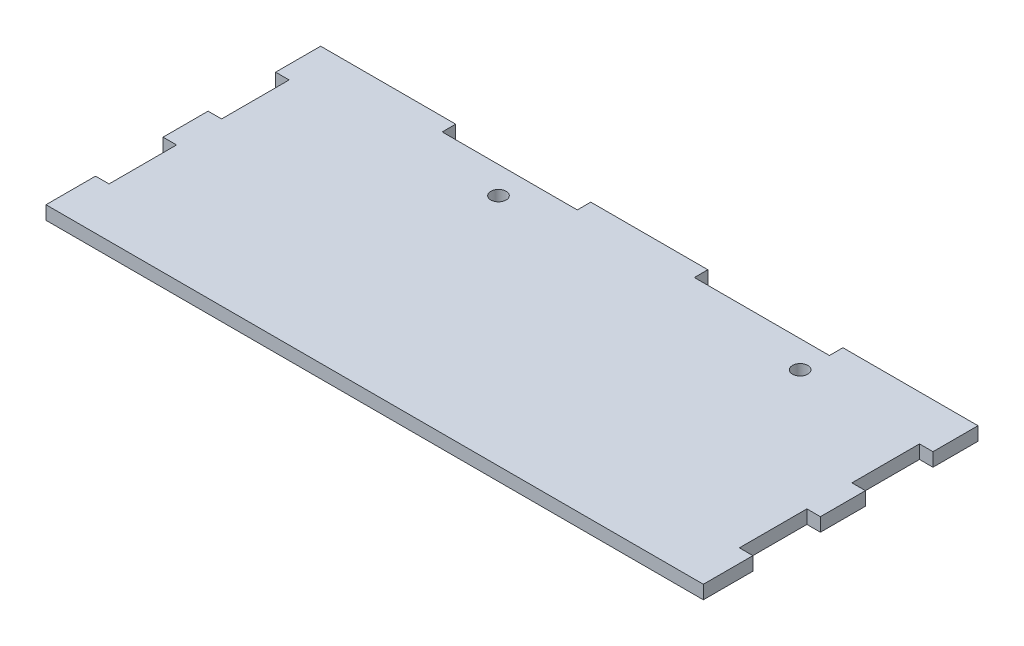
ISO-10303-21;
HEADER;
FILE_DESCRIPTION(('STEP AP214'),'2;1');
FILE_NAME('part.step','',(''),(''),'','','');
FILE_SCHEMA(('AUTOMOTIVE_DESIGN { 1 0 10303 214 1 1 1 1 }'));
ENDSEC;
DATA;
#1=APPLICATION_CONTEXT('core data for automotive mechanical design processes');
#2=APPLICATION_PROTOCOL_DEFINITION('international standard','automotive_design',2000,#1);
#3=PRODUCT_CONTEXT('',#1,'mechanical');
#4=PRODUCT('Part','Part','',(#3));
#5=PRODUCT_RELATED_PRODUCT_CATEGORY('part','',(#4));
#6=PRODUCT_DEFINITION_FORMATION('','',#4);
#7=PRODUCT_DEFINITION_CONTEXT('part definition',#1,'design');
#8=PRODUCT_DEFINITION('design','',#6,#7);
#9=PRODUCT_DEFINITION_SHAPE('','',#8);
#10=(LENGTH_UNIT() NAMED_UNIT(*) SI_UNIT(.MILLI.,.METRE.));
#11=(NAMED_UNIT(*) PLANE_ANGLE_UNIT() SI_UNIT($,.RADIAN.));
#12=(NAMED_UNIT(*) SI_UNIT($,.STERADIAN.) SOLID_ANGLE_UNIT());
#13=UNCERTAINTY_MEASURE_WITH_UNIT(LENGTH_MEASURE(1.E-05),#10,'distance_accuracy_value','');
#14=(GEOMETRIC_REPRESENTATION_CONTEXT(3) GLOBAL_UNCERTAINTY_ASSIGNED_CONTEXT((#13)) GLOBAL_UNIT_ASSIGNED_CONTEXT((#10,
#11,#12)) REPRESENTATION_CONTEXT('',''));
#15=CARTESIAN_POINT('',(0.,0.,0.));
#16=DIRECTION('',(0.,0.,1.));
#17=DIRECTION('',(1.,0.,0.));
#18=AXIS2_PLACEMENT_3D('',#15,#16,#17);
#19=CARTESIAN_POINT('',(-73.,3.,30.5));
#20=DIRECTION('',(1.,0.,0.));
#21=DIRECTION('',(0.,0.,-1.));
#22=AXIS2_PLACEMENT_3D('',#19,#20,#21);
#23=PLANE('',#22);
#24=DIRECTION('',(0.,0.,1.));
#25=VECTOR('',#24,1.);
#26=CARTESIAN_POINT('',(-73.,0.,30.5));
#27=LINE('',#26,#25);
#28=CARTESIAN_POINT('',(-73.,0.,-5.49999999999998));
#29=VERTEX_POINT('',#28);
#30=CARTESIAN_POINT('',(-73.,0.,4.50000000000002));
#31=VERTEX_POINT('',#30);
#32=EDGE_CURVE('E284',#29,#31,#27,.T.);
#33=ORIENTED_EDGE('',*,*,#32,.T.);
#34=DIRECTION('',(0.,1.,0.));
#35=VECTOR('',#34,1.);
#36=CARTESIAN_POINT('',(-73.,-7.,4.50000000000002));
#37=LINE('',#36,#35);
#38=CARTESIAN_POINT('',(-73.,3.,4.50000000000002));
#39=VERTEX_POINT('',#38);
#40=EDGE_CURVE('E526',#31,#39,#37,.T.);
#41=ORIENTED_EDGE('',*,*,#40,.T.);
#42=DIRECTION('',(0.,0.,1.));
#43=VECTOR('',#42,1.);
#44=CARTESIAN_POINT('',(-73.,3.,30.5));
#45=LINE('',#44,#43);
#46=CARTESIAN_POINT('',(-73.,3.,-5.49999999999998));
#47=VERTEX_POINT('',#46);
#48=EDGE_CURVE('E459',#47,#39,#45,.T.);
#49=ORIENTED_EDGE('',*,*,#48,.F.);
#50=DIRECTION('',(0.,1.,0.));
#51=VECTOR('',#50,1.);
#52=CARTESIAN_POINT('',(-73.,-7.,-5.49999999999998));
#53=LINE('',#52,#51);
#54=EDGE_CURVE('E428',#29,#47,#53,.T.);
#55=ORIENTED_EDGE('',*,*,#54,.F.);
#56=EDGE_LOOP('',(#33,#41,#49,#55));
#57=FACE_BOUND('',#56,.T.);
#58=ADVANCED_FACE('F51',(#57),#23,.F.);
#59=CARTESIAN_POINT('',(-73.,0.,-30.5));
#60=VERTEX_POINT('',#59);
#61=CARTESIAN_POINT('',(-73.,0.,-20.5));
#62=VERTEX_POINT('',#61);
#63=EDGE_CURVE('E279',#60,#62,#27,.T.);
#64=ORIENTED_EDGE('',*,*,#63,.T.);
#65=DIRECTION('',(0.,1.,0.));
#66=VECTOR('',#65,1.);
#67=CARTESIAN_POINT('',(-73.,-7.,-20.5));
#68=LINE('',#67,#66);
#69=CARTESIAN_POINT('',(-73.,3.,-20.5));
#70=VERTEX_POINT('',#69);
#71=EDGE_CURVE('E438',#62,#70,#68,.T.);
#72=ORIENTED_EDGE('',*,*,#71,.T.);
#73=CARTESIAN_POINT('',(-73.,3.,-30.5));
#74=VERTEX_POINT('',#73);
#75=EDGE_CURVE('E455',#74,#70,#45,.T.);
#76=ORIENTED_EDGE('',*,*,#75,.F.);
#77=DIRECTION('',(0.,-1.,0.));
#78=VECTOR('',#77,1.);
#79=CARTESIAN_POINT('',(-73.,3.,-30.5));
#80=LINE('',#79,#78);
#81=EDGE_CURVE('E274',#74,#60,#80,.T.);
#82=ORIENTED_EDGE('',*,*,#81,.T.);
#83=EDGE_LOOP('',(#64,#72,#76,#82));
#84=FACE_BOUND('',#83,.T.);
#85=ADVANCED_FACE('F590',(#84),#23,.F.);
#86=CARTESIAN_POINT('',(73.,3.,30.5));
#87=DIRECTION('',(-1.,0.,0.));
#88=DIRECTION('',(0.,0.,1.));
#89=AXIS2_PLACEMENT_3D('',#86,#87,#88);
#90=PLANE('',#89);
#91=DIRECTION('',(0.,0.,-1.));
#92=VECTOR('',#91,1.);
#93=CARTESIAN_POINT('',(73.,0.,30.5));
#94=LINE('',#93,#92);
#95=CARTESIAN_POINT('',(73.,0.,4.50000000000002));
#96=VERTEX_POINT('',#95);
#97=CARTESIAN_POINT('',(73.,0.,-5.49999999999998));
#98=VERTEX_POINT('',#97);
#99=EDGE_CURVE('E294',#96,#98,#94,.T.);
#100=ORIENTED_EDGE('',*,*,#99,.T.);
#101=DIRECTION('',(0.,1.,0.));
#102=VECTOR('',#101,1.);
#103=CARTESIAN_POINT('',(73.,-7.,-5.49999999999998));
#104=LINE('',#103,#102);
#105=CARTESIAN_POINT('',(73.,3.,-5.49999999999998));
#106=VERTEX_POINT('',#105);
#107=EDGE_CURVE('E403',#98,#106,#104,.T.);
#108=ORIENTED_EDGE('',*,*,#107,.T.);
#109=DIRECTION('',(0.,0.,-1.));
#110=VECTOR('',#109,1.);
#111=CARTESIAN_POINT('',(73.,3.,30.5));
#112=LINE('',#111,#110);
#113=CARTESIAN_POINT('',(73.,3.,4.50000000000002));
#114=VERTEX_POINT('',#113);
#115=EDGE_CURVE('E466',#114,#106,#112,.T.);
#116=ORIENTED_EDGE('',*,*,#115,.F.);
#117=DIRECTION('',(0.,1.,0.));
#118=VECTOR('',#117,1.);
#119=CARTESIAN_POINT('',(73.,-7.,4.50000000000002));
#120=LINE('',#119,#118);
#121=EDGE_CURVE('E486',#96,#114,#120,.T.);
#122=ORIENTED_EDGE('',*,*,#121,.F.);
#123=EDGE_LOOP('',(#100,#108,#116,#122));
#124=FACE_BOUND('',#123,.T.);
#125=ADVANCED_FACE('F576',(#124),#90,.F.);
#126=CARTESIAN_POINT('',(73.,3.,-20.5));
#127=VERTEX_POINT('',#126);
#128=CARTESIAN_POINT('',(73.,3.,-30.5));
#129=VERTEX_POINT('',#128);
#130=EDGE_CURVE('E461',#127,#129,#112,.T.);
#131=ORIENTED_EDGE('',*,*,#130,.F.);
#132=DIRECTION('',(0.,1.,0.));
#133=VECTOR('',#132,1.);
#134=CARTESIAN_POINT('',(73.,-7.,-20.5));
#135=LINE('',#134,#133);
#136=CARTESIAN_POINT('',(73.,0.,-20.5));
#137=VERTEX_POINT('',#136);
#138=EDGE_CURVE('E407',#137,#127,#135,.T.);
#139=ORIENTED_EDGE('',*,*,#138,.F.);
#140=CARTESIAN_POINT('',(73.,0.,-30.5));
#141=VERTEX_POINT('',#140);
#142=EDGE_CURVE('E288',#137,#141,#94,.T.);
#143=ORIENTED_EDGE('',*,*,#142,.T.);
#144=DIRECTION('',(0.,-1.,0.));
#145=VECTOR('',#144,1.);
#146=CARTESIAN_POINT('',(73.,3.,-30.5));
#147=LINE('',#146,#145);
#148=EDGE_CURVE('E304',#129,#141,#147,.T.);
#149=ORIENTED_EDGE('',*,*,#148,.F.);
#150=EDGE_LOOP('',(#131,#139,#143,#149));
#151=FACE_BOUND('',#150,.T.);
#152=ADVANCED_FACE('F549',(#151),#90,.F.);
#153=CARTESIAN_POINT('',(73.,3.,-30.5));
#154=DIRECTION('',(0.,0.,1.));
#155=DIRECTION('',(1.,0.,0.));
#156=AXIS2_PLACEMENT_3D('',#153,#154,#155);
#157=PLANE('',#156);
#158=DIRECTION('',(-1.,0.,0.));
#159=VECTOR('',#158,1.);
#160=CARTESIAN_POINT('',(73.,3.,-30.5));
#161=LINE('',#160,#159);
#162=CARTESIAN_POINT('',(13.,3.,-30.5));
#163=VERTEX_POINT('',#162);
#164=CARTESIAN_POINT('',(-13.,3.,-30.5));
#165=VERTEX_POINT('',#164);
#166=EDGE_CURVE('E258',#163,#165,#161,.T.);
#167=ORIENTED_EDGE('',*,*,#166,.F.);
#168=DIRECTION('',(0.,1.,0.));
#169=VECTOR('',#168,1.);
#170=CARTESIAN_POINT('',(13.,-7.,-30.5));
#171=LINE('',#170,#169);
#172=CARTESIAN_POINT('',(13.,0.,-30.5));
#173=VERTEX_POINT('',#172);
#174=EDGE_CURVE('E237',#173,#163,#171,.T.);
#175=ORIENTED_EDGE('',*,*,#174,.F.);
#176=DIRECTION('',(-1.,0.,0.));
#177=VECTOR('',#176,1.);
#178=CARTESIAN_POINT('',(73.,0.,-30.5));
#179=LINE('',#178,#177);
#180=CARTESIAN_POINT('',(-13.,0.,-30.5));
#181=VERTEX_POINT('',#180);
#182=EDGE_CURVE('E300',#173,#181,#179,.T.);
#183=ORIENTED_EDGE('',*,*,#182,.T.);
#184=DIRECTION('',(0.,1.,0.));
#185=VECTOR('',#184,1.);
#186=CARTESIAN_POINT('',(-13.,-7.,-30.5));
#187=LINE('',#186,#185);
#188=EDGE_CURVE('E263',#181,#165,#187,.T.);
#189=ORIENTED_EDGE('',*,*,#188,.T.);
#190=EDGE_LOOP('',(#167,#175,#183,#189));
#191=FACE_BOUND('',#190,.T.);
#192=ADVANCED_FACE('F266',(#191),#157,.F.);
#193=CARTESIAN_POINT('',(43.,0.,-30.5));
#194=VERTEX_POINT('',#193);
#195=EDGE_CURVE('E295',#141,#194,#179,.T.);
#196=ORIENTED_EDGE('',*,*,#195,.T.);
#197=DIRECTION('',(0.,1.,0.));
#198=VECTOR('',#197,1.);
#199=CARTESIAN_POINT('',(43.,-7.,-30.5));
#200=LINE('',#199,#198);
#201=CARTESIAN_POINT('',(43.,3.,-30.5));
#202=VERTEX_POINT('',#201);
#203=EDGE_CURVE('E250',#194,#202,#200,.T.);
#204=ORIENTED_EDGE('',*,*,#203,.T.);
#205=EDGE_CURVE('E268',#129,#202,#161,.T.);
#206=ORIENTED_EDGE('',*,*,#205,.F.);
#207=ORIENTED_EDGE('',*,*,#148,.T.);
#208=EDGE_LOOP('',(#196,#204,#206,#207));
#209=FACE_BOUND('',#208,.T.);
#210=ADVANCED_FACE('F554',(#209),#157,.F.);
#211=CARTESIAN_POINT('',(-73.,3.,19.5));
#212=VERTEX_POINT('',#211);
#213=CARTESIAN_POINT('',(-73.,3.,30.5));
#214=VERTEX_POINT('',#213);
#215=EDGE_CURVE('E299',#212,#214,#45,.T.);
#216=ORIENTED_EDGE('',*,*,#215,.F.);
#217=DIRECTION('',(0.,1.,0.));
#218=VECTOR('',#217,1.);
#219=CARTESIAN_POINT('',(-73.,-7.,19.5));
#220=LINE('',#219,#218);
#221=CARTESIAN_POINT('',(-73.,0.,19.5));
#222=VERTEX_POINT('',#221);
#223=EDGE_CURVE('E531',#222,#212,#220,.T.);
#224=ORIENTED_EDGE('',*,*,#223,.F.);
#225=CARTESIAN_POINT('',(-73.,0.,30.5));
#226=VERTEX_POINT('',#225);
#227=EDGE_CURVE('E285',#222,#226,#27,.T.);
#228=ORIENTED_EDGE('',*,*,#227,.T.);
#229=DIRECTION('',(0.,-1.,0.));
#230=VECTOR('',#229,1.);
#231=CARTESIAN_POINT('',(-73.,3.,30.5));
#232=LINE('',#231,#230);
#233=EDGE_CURVE('E312',#214,#226,#232,.T.);
#234=ORIENTED_EDGE('',*,*,#233,.F.);
#235=EDGE_LOOP('',(#216,#224,#228,#234));
#236=FACE_BOUND('',#235,.T.);
#237=ADVANCED_FACE('F53',(#236),#23,.F.);
#238=CARTESIAN_POINT('',(73.,3.,30.5));
#239=DIRECTION('',(0.,0.,-1.));
#240=DIRECTION('',(-1.,0.,0.));
#241=AXIS2_PLACEMENT_3D('',#238,#239,#240);
#242=PLANE('',#241);
#243=DIRECTION('',(1.,0.,0.));
#244=VECTOR('',#243,1.);
#245=CARTESIAN_POINT('',(73.,0.,30.5));
#246=LINE('',#245,#244);
#247=CARTESIAN_POINT('',(73.,0.,30.5));
#248=VERTEX_POINT('',#247);
#249=EDGE_CURVE('E283',#226,#248,#246,.T.);
#250=ORIENTED_EDGE('',*,*,#249,.T.);
#251=DIRECTION('',(0.,-1.,0.));
#252=VECTOR('',#251,1.);
#253=CARTESIAN_POINT('',(73.,3.,30.5));
#254=LINE('',#253,#252);
#255=CARTESIAN_POINT('',(73.,3.,30.5));
#256=VERTEX_POINT('',#255);
#257=EDGE_CURVE('E308',#256,#248,#254,.T.);
#258=ORIENTED_EDGE('',*,*,#257,.F.);
#259=DIRECTION('',(1.,0.,0.));
#260=VECTOR('',#259,1.);
#261=CARTESIAN_POINT('',(73.,3.,30.5));
#262=LINE('',#261,#260);
#263=EDGE_CURVE('E458',#214,#256,#262,.T.);
#264=ORIENTED_EDGE('',*,*,#263,.F.);
#265=ORIENTED_EDGE('',*,*,#233,.T.);
#266=EDGE_LOOP('',(#250,#258,#264,#265));
#267=FACE_BOUND('',#266,.T.);
#268=ADVANCED_FACE('F599',(#267),#242,.F.);
#269=CARTESIAN_POINT('',(73.,0.,19.5));
#270=VERTEX_POINT('',#269);
#271=EDGE_CURVE('E289',#248,#270,#94,.T.);
#272=ORIENTED_EDGE('',*,*,#271,.T.);
#273=DIRECTION('',(0.,1.,0.));
#274=VECTOR('',#273,1.);
#275=CARTESIAN_POINT('',(73.,-7.,19.5));
#276=LINE('',#275,#274);
#277=CARTESIAN_POINT('',(73.,3.,19.5));
#278=VERTEX_POINT('',#277);
#279=EDGE_CURVE('E481',#270,#278,#276,.T.);
#280=ORIENTED_EDGE('',*,*,#279,.T.);
#281=EDGE_CURVE('E275',#256,#278,#112,.T.);
#282=ORIENTED_EDGE('',*,*,#281,.F.);
#283=ORIENTED_EDGE('',*,*,#257,.T.);
#284=EDGE_LOOP('',(#272,#280,#282,#283));
#285=FACE_BOUND('',#284,.T.);
#286=ADVANCED_FACE('F479',(#285),#90,.F.);
#287=CARTESIAN_POINT('',(-43.,3.,-30.5));
#288=VERTEX_POINT('',#287);
#289=EDGE_CURVE('E269',#288,#74,#161,.T.);
#290=ORIENTED_EDGE('',*,*,#289,.F.);
#291=DIRECTION('',(0.,1.,0.));
#292=VECTOR('',#291,1.);
#293=CARTESIAN_POINT('',(-43.,-7.,-30.5));
#294=LINE('',#293,#292);
#295=CARTESIAN_POINT('',(-43.,0.,-30.5));
#296=VERTEX_POINT('',#295);
#297=EDGE_CURVE('E505',#296,#288,#294,.T.);
#298=ORIENTED_EDGE('',*,*,#297,.F.);
#299=EDGE_CURVE('E293',#296,#60,#179,.T.);
#300=ORIENTED_EDGE('',*,*,#299,.T.);
#301=ORIENTED_EDGE('',*,*,#81,.F.);
#302=EDGE_LOOP('',(#290,#298,#300,#301));
#303=FACE_BOUND('',#302,.T.);
#304=ADVANCED_FACE('F607',(#303),#157,.F.);
#305=CARTESIAN_POINT('',(0.,3.,0.));
#306=DIRECTION('',(0.,1.,0.));
#307=DIRECTION('',(0.,0.,1.));
#308=AXIS2_PLACEMENT_3D('',#305,#306,#307);
#309=PLANE('',#308);
#310=DIRECTION('',(1.,0.,0.));
#311=VECTOR('',#310,1.);
#312=CARTESIAN_POINT('',(70.,3.,-5.49999999999998));
#313=LINE('',#312,#311);
#314=CARTESIAN_POINT('',(70.,3.,-5.49999999999998));
#315=VERTEX_POINT('',#314);
#316=EDGE_CURVE('E414',#315,#106,#313,.T.);
#317=ORIENTED_EDGE('',*,*,#316,.F.);
#318=DIRECTION('',(0.,0.,1.));
#319=VECTOR('',#318,1.);
#320=CARTESIAN_POINT('',(70.,3.,-20.5));
#321=LINE('',#320,#319);
#322=CARTESIAN_POINT('',(70.,3.,-20.5));
#323=VERTEX_POINT('',#322);
#324=EDGE_CURVE('E400',#323,#315,#321,.T.);
#325=ORIENTED_EDGE('',*,*,#324,.F.);
#326=DIRECTION('',(-1.,0.,0.));
#327=VECTOR('',#326,1.);
#328=CARTESIAN_POINT('',(73.,3.,-20.5));
#329=LINE('',#328,#327);
#330=EDGE_CURVE('E419',#127,#323,#329,.T.);
#331=ORIENTED_EDGE('',*,*,#330,.F.);
#332=ORIENTED_EDGE('',*,*,#130,.T.);
#333=ORIENTED_EDGE('',*,*,#205,.T.);
#334=DIRECTION('',(0.,0.,-1.));
#335=VECTOR('',#334,1.);
#336=CARTESIAN_POINT('',(43.,3.,-27.5));
#337=LINE('',#336,#335);
#338=CARTESIAN_POINT('',(43.,3.,-27.5));
#339=VERTEX_POINT('',#338);
#340=EDGE_CURVE('E555',#339,#202,#337,.T.);
#341=ORIENTED_EDGE('',*,*,#340,.F.);
#342=DIRECTION('',(1.,0.,0.));
#343=VECTOR('',#342,1.);
#344=CARTESIAN_POINT('',(13.,3.,-27.5));
#345=LINE('',#344,#343);
#346=CARTESIAN_POINT('',(13.,3.,-27.5));
#347=VERTEX_POINT('',#346);
#348=EDGE_CURVE('E261',#347,#339,#345,.T.);
#349=ORIENTED_EDGE('',*,*,#348,.F.);
#350=DIRECTION('',(0.,0.,1.));
#351=VECTOR('',#350,1.);
#352=CARTESIAN_POINT('',(13.,3.,-30.5));
#353=LINE('',#352,#351);
#354=EDGE_CURVE('E241',#163,#347,#353,.T.);
#355=ORIENTED_EDGE('',*,*,#354,.F.);
#356=ORIENTED_EDGE('',*,*,#166,.T.);
#357=DIRECTION('',(0.,0.,-1.));
#358=VECTOR('',#357,1.);
#359=CARTESIAN_POINT('',(-13.,3.,-27.5));
#360=LINE('',#359,#358);
#361=CARTESIAN_POINT('',(-13.,3.,-27.5));
#362=VERTEX_POINT('',#361);
#363=EDGE_CURVE('E508',#362,#165,#360,.T.);
#364=ORIENTED_EDGE('',*,*,#363,.F.);
#365=DIRECTION('',(1.,0.,0.));
#366=VECTOR('',#365,1.);
#367=CARTESIAN_POINT('',(-43.,3.,-27.5));
#368=LINE('',#367,#366);
#369=CARTESIAN_POINT('',(-43.,3.,-27.5));
#370=VERTEX_POINT('',#369);
#371=EDGE_CURVE('E519',#370,#362,#368,.T.);
#372=ORIENTED_EDGE('',*,*,#371,.F.);
#373=DIRECTION('',(0.,0.,1.));
#374=VECTOR('',#373,1.);
#375=CARTESIAN_POINT('',(-43.,3.,-30.5));
#376=LINE('',#375,#374);
#377=EDGE_CURVE('E492',#288,#370,#376,.T.);
#378=ORIENTED_EDGE('',*,*,#377,.F.);
#379=ORIENTED_EDGE('',*,*,#289,.T.);
#380=ORIENTED_EDGE('',*,*,#75,.T.);
#381=DIRECTION('',(-1.,0.,0.));
#382=VECTOR('',#381,1.);
#383=CARTESIAN_POINT('',(-73.,3.,-20.5));
#384=LINE('',#383,#382);
#385=CARTESIAN_POINT('',(-70.,3.,-20.5));
#386=VERTEX_POINT('',#385);
#387=EDGE_CURVE('E431',#386,#70,#384,.T.);
#388=ORIENTED_EDGE('',*,*,#387,.F.);
#389=DIRECTION('',(0.,0.,-1.));
#390=VECTOR('',#389,1.);
#391=CARTESIAN_POINT('',(-70.,3.,-20.5));
#392=LINE('',#391,#390);
#393=CARTESIAN_POINT('',(-70.,3.,-5.49999999999998));
#394=VERTEX_POINT('',#393);
#395=EDGE_CURVE('E445',#394,#386,#392,.T.);
#396=ORIENTED_EDGE('',*,*,#395,.F.);
#397=DIRECTION('',(1.,0.,0.));
#398=VECTOR('',#397,1.);
#399=CARTESIAN_POINT('',(-70.,3.,-5.49999999999998));
#400=LINE('',#399,#398);
#401=EDGE_CURVE('E427',#47,#394,#400,.T.);
#402=ORIENTED_EDGE('',*,*,#401,.F.);
#403=ORIENTED_EDGE('',*,*,#48,.T.);
#404=DIRECTION('',(-1.,0.,0.));
#405=VECTOR('',#404,1.);
#406=CARTESIAN_POINT('',(-73.,3.,4.50000000000002));
#407=LINE('',#406,#405);
#408=CARTESIAN_POINT('',(-70.,3.,4.50000000000002));
#409=VERTEX_POINT('',#408);
#410=EDGE_CURVE('E442',#409,#39,#407,.T.);
#411=ORIENTED_EDGE('',*,*,#410,.F.);
#412=DIRECTION('',(0.,0.,-1.));
#413=VECTOR('',#412,1.);
#414=CARTESIAN_POINT('',(-70.,3.,4.50000000000002));
#415=LINE('',#414,#413);
#416=CARTESIAN_POINT('',(-70.,3.,19.5));
#417=VERTEX_POINT('',#416);
#418=EDGE_CURVE('E530',#417,#409,#415,.T.);
#419=ORIENTED_EDGE('',*,*,#418,.F.);
#420=DIRECTION('',(1.,0.,0.));
#421=VECTOR('',#420,1.);
#422=CARTESIAN_POINT('',(-70.,3.,19.5));
#423=LINE('',#422,#421);
#424=EDGE_CURVE('E541',#212,#417,#423,.T.);
#425=ORIENTED_EDGE('',*,*,#424,.F.);
#426=ORIENTED_EDGE('',*,*,#215,.T.);
#427=ORIENTED_EDGE('',*,*,#263,.T.);
#428=ORIENTED_EDGE('',*,*,#281,.T.);
#429=DIRECTION('',(1.,0.,0.));
#430=VECTOR('',#429,1.);
#431=CARTESIAN_POINT('',(70.,3.,19.5));
#432=LINE('',#431,#430);
#433=CARTESIAN_POINT('',(70.,3.,19.5));
#434=VERTEX_POINT('',#433);
#435=EDGE_CURVE('E476',#434,#278,#432,.T.);
#436=ORIENTED_EDGE('',*,*,#435,.F.);
#437=DIRECTION('',(0.,0.,1.));
#438=VECTOR('',#437,1.);
#439=CARTESIAN_POINT('',(70.,3.,4.50000000000002));
#440=LINE('',#439,#438);
#441=CARTESIAN_POINT('',(70.,3.,4.50000000000002));
#442=VERTEX_POINT('',#441);
#443=EDGE_CURVE('E498',#442,#434,#440,.T.);
#444=ORIENTED_EDGE('',*,*,#443,.F.);
#445=DIRECTION('',(-1.,0.,0.));
#446=VECTOR('',#445,1.);
#447=CARTESIAN_POINT('',(73.,3.,4.50000000000002));
#448=LINE('',#447,#446);
#449=EDGE_CURVE('E410',#114,#442,#448,.T.);
#450=ORIENTED_EDGE('',*,*,#449,.F.);
#451=ORIENTED_EDGE('',*,*,#115,.T.);
#452=EDGE_LOOP('',(#317,#325,#331,#332,#333,#341,#349,#355,#356,#364,#372,#378,#379,#380,#388,
#396,#402,#403,#411,#419,#425,#426,#427,#428,#436,#444,#450,#451));
#453=FACE_BOUND('',#452,.T.);
#454=CARTESIAN_POINT('',(42.5,3.,-21.5));
#455=DIRECTION('',(0.,1.,0.));
#456=DIRECTION('',(0.,0.,1.));
#457=AXIS2_PLACEMENT_3D('',#454,#455,#456);
#458=CIRCLE('',#457,1.7);
#459=CARTESIAN_POINT('',(42.5,3.,-19.8));
#460=VERTEX_POINT('',#459);
#461=EDGE_CURVE('E423',#460,#460,#458,.T.);
#462=ORIENTED_EDGE('',*,*,#461,.F.);
#463=EDGE_LOOP('',(#462));
#464=FACE_BOUND('',#463,.T.);
#465=CARTESIAN_POINT('',(-24.5,3.,-21.5));
#466=DIRECTION('',(0.,1.,0.));
#467=DIRECTION('',(0.,0.,1.));
#468=AXIS2_PLACEMENT_3D('',#465,#466,#467);
#469=CIRCLE('',#468,1.7);
#470=CARTESIAN_POINT('',(-24.5,3.,-19.8));
#471=VERTEX_POINT('',#470);
#472=EDGE_CURVE('E322',#471,#471,#469,.T.);
#473=ORIENTED_EDGE('',*,*,#472,.F.);
#474=EDGE_LOOP('',(#473));
#475=FACE_BOUND('',#474,.T.);
#476=ADVANCED_FACE('F255',(#453,#464,#475),#309,.T.);
#477=CARTESIAN_POINT('',(0.,0.,0.));
#478=DIRECTION('',(0.,1.,0.));
#479=DIRECTION('',(0.,0.,1.));
#480=AXIS2_PLACEMENT_3D('',#477,#478,#479);
#481=PLANE('',#480);
#482=CARTESIAN_POINT('',(42.5,0.,-21.5));
#483=DIRECTION('',(0.,1.,0.));
#484=DIRECTION('',(0.,0.,1.));
#485=AXIS2_PLACEMENT_3D('',#482,#483,#484);
#486=CIRCLE('',#485,1.7);
#487=CARTESIAN_POINT('',(42.5,0.,-19.8));
#488=VERTEX_POINT('',#487);
#489=EDGE_CURVE('E321',#488,#488,#486,.T.);
#490=ORIENTED_EDGE('',*,*,#489,.T.);
#491=EDGE_LOOP('',(#490));
#492=FACE_BOUND('',#491,.T.);
#493=DIRECTION('',(0.,0.,1.));
#494=VECTOR('',#493,1.);
#495=CARTESIAN_POINT('',(70.,0.,0.));
#496=LINE('',#495,#494);
#497=CARTESIAN_POINT('',(70.,0.,-20.5));
#498=VERTEX_POINT('',#497);
#499=CARTESIAN_POINT('',(70.,0.,-5.49999999999998));
#500=VERTEX_POINT('',#499);
#501=EDGE_CURVE('E60',#498,#500,#496,.T.);
#502=ORIENTED_EDGE('',*,*,#501,.T.);
#503=DIRECTION('',(1.,0.,0.));
#504=VECTOR('',#503,1.);
#505=CARTESIAN_POINT('',(0.,0.,-5.50000000000013));
#506=LINE('',#505,#504);
#507=EDGE_CURVE('E11',#500,#98,#506,.T.);
#508=ORIENTED_EDGE('',*,*,#507,.T.);
#509=ORIENTED_EDGE('',*,*,#99,.F.);
#510=DIRECTION('',(-1.,0.,0.));
#511=VECTOR('',#510,1.);
#512=CARTESIAN_POINT('',(0.,0.,4.49999999999996));
#513=LINE('',#512,#511);
#514=CARTESIAN_POINT('',(70.,0.,4.50000000000002));
#515=VERTEX_POINT('',#514);
#516=EDGE_CURVE('E330',#96,#515,#513,.T.);
#517=ORIENTED_EDGE('',*,*,#516,.T.);
#518=DIRECTION('',(0.,0.,1.));
#519=VECTOR('',#518,1.);
#520=CARTESIAN_POINT('',(70.,0.,0.));
#521=LINE('',#520,#519);
#522=CARTESIAN_POINT('',(70.,0.,19.5));
#523=VERTEX_POINT('',#522);
#524=EDGE_CURVE('E316',#515,#523,#521,.T.);
#525=ORIENTED_EDGE('',*,*,#524,.T.);
#526=DIRECTION('',(1.,0.,0.));
#527=VECTOR('',#526,1.);
#528=CARTESIAN_POINT('',(0.,0.,19.5));
#529=LINE('',#528,#527);
#530=EDGE_CURVE('E326',#523,#270,#529,.T.);
#531=ORIENTED_EDGE('',*,*,#530,.T.);
#532=ORIENTED_EDGE('',*,*,#271,.F.);
#533=ORIENTED_EDGE('',*,*,#249,.F.);
#534=ORIENTED_EDGE('',*,*,#227,.F.);
#535=DIRECTION('',(1.,0.,0.));
#536=VECTOR('',#535,1.);
#537=CARTESIAN_POINT('',(0.,0.,19.4999999999999));
#538=LINE('',#537,#536);
#539=CARTESIAN_POINT('',(-70.,0.,19.5));
#540=VERTEX_POINT('',#539);
#541=EDGE_CURVE('E371',#222,#540,#538,.T.);
#542=ORIENTED_EDGE('',*,*,#541,.T.);
#543=DIRECTION('',(0.,0.,-1.));
#544=VECTOR('',#543,1.);
#545=CARTESIAN_POINT('',(-70.,0.,0.));
#546=LINE('',#545,#544);
#547=CARTESIAN_POINT('',(-70.,0.,4.50000000000002));
#548=VERTEX_POINT('',#547);
#549=EDGE_CURVE('E375',#540,#548,#546,.T.);
#550=ORIENTED_EDGE('',*,*,#549,.T.);
#551=DIRECTION('',(-1.,0.,0.));
#552=VECTOR('',#551,1.);
#553=CARTESIAN_POINT('',(0.,0.,4.50000000000002));
#554=LINE('',#553,#552);
#555=EDGE_CURVE('E379',#548,#31,#554,.T.);
#556=ORIENTED_EDGE('',*,*,#555,.T.);
#557=ORIENTED_EDGE('',*,*,#32,.F.);
#558=DIRECTION('',(1.,0.,0.));
#559=VECTOR('',#558,1.);
#560=CARTESIAN_POINT('',(0.,0.,-5.49999999999998));
#561=LINE('',#560,#559);
#562=CARTESIAN_POINT('',(-70.,0.,-5.49999999999998));
#563=VERTEX_POINT('',#562);
#564=EDGE_CURVE('E356',#29,#563,#561,.T.);
#565=ORIENTED_EDGE('',*,*,#564,.T.);
#566=DIRECTION('',(0.,0.,-1.));
#567=VECTOR('',#566,1.);
#568=CARTESIAN_POINT('',(-70.,0.,0.));
#569=LINE('',#568,#567);
#570=CARTESIAN_POINT('',(-70.,0.,-20.5));
#571=VERTEX_POINT('',#570);
#572=EDGE_CURVE('E363',#563,#571,#569,.T.);
#573=ORIENTED_EDGE('',*,*,#572,.T.);
#574=DIRECTION('',(-1.,0.,0.));
#575=VECTOR('',#574,1.);
#576=CARTESIAN_POINT('',(0.,0.,-20.5));
#577=LINE('',#576,#575);
#578=EDGE_CURVE('E367',#571,#62,#577,.T.);
#579=ORIENTED_EDGE('',*,*,#578,.T.);
#580=ORIENTED_EDGE('',*,*,#63,.F.);
#581=ORIENTED_EDGE('',*,*,#299,.F.);
#582=DIRECTION('',(0.,0.,1.));
#583=VECTOR('',#582,1.);
#584=CARTESIAN_POINT('',(-43.,0.,0.));
#585=LINE('',#584,#583);
#586=CARTESIAN_POINT('',(-43.,0.,-27.5));
#587=VERTEX_POINT('',#586);
#588=EDGE_CURVE('E334',#296,#587,#585,.T.);
#589=ORIENTED_EDGE('',*,*,#588,.T.);
#590=DIRECTION('',(1.,0.,0.));
#591=VECTOR('',#590,1.);
#592=CARTESIAN_POINT('',(0.,0.,-27.5));
#593=LINE('',#592,#591);
#594=CARTESIAN_POINT('',(-13.,0.,-27.5));
#595=VERTEX_POINT('',#594);
#596=EDGE_CURVE('E338',#587,#595,#593,.T.);
#597=ORIENTED_EDGE('',*,*,#596,.T.);
#598=DIRECTION('',(0.,0.,-1.));
#599=VECTOR('',#598,1.);
#600=CARTESIAN_POINT('',(-13.,0.,0.));
#601=LINE('',#600,#599);
#602=EDGE_CURVE('E342',#595,#181,#601,.T.);
#603=ORIENTED_EDGE('',*,*,#602,.T.);
#604=ORIENTED_EDGE('',*,*,#182,.F.);
#605=DIRECTION('',(0.,0.,1.));
#606=VECTOR('',#605,1.);
#607=CARTESIAN_POINT('',(13.,0.,0.));
#608=LINE('',#607,#606);
#609=CARTESIAN_POINT('',(13.,0.,-27.5));
#610=VERTEX_POINT('',#609);
#611=EDGE_CURVE('E244',#173,#610,#608,.T.);
#612=ORIENTED_EDGE('',*,*,#611,.T.);
#613=DIRECTION('',(1.,0.,0.));
#614=VECTOR('',#613,1.);
#615=CARTESIAN_POINT('',(0.,0.,-27.5));
#616=LINE('',#615,#614);
#617=CARTESIAN_POINT('',(43.,0.,-27.5));
#618=VERTEX_POINT('',#617);
#619=EDGE_CURVE('E346',#610,#618,#616,.T.);
#620=ORIENTED_EDGE('',*,*,#619,.T.);
#621=DIRECTION('',(0.,0.,-1.));
#622=VECTOR('',#621,1.);
#623=CARTESIAN_POINT('',(43.,0.,0.));
#624=LINE('',#623,#622);
#625=EDGE_CURVE('E350',#618,#194,#624,.T.);
#626=ORIENTED_EDGE('',*,*,#625,.T.);
#627=ORIENTED_EDGE('',*,*,#195,.F.);
#628=ORIENTED_EDGE('',*,*,#142,.F.);
#629=DIRECTION('',(-1.,0.,0.));
#630=VECTOR('',#629,1.);
#631=CARTESIAN_POINT('',(0.,0.,-20.5000000000001));
#632=LINE('',#631,#630);
#633=EDGE_CURVE('E383',#137,#498,#632,.T.);
#634=ORIENTED_EDGE('',*,*,#633,.T.);
#635=EDGE_LOOP('',(#502,#508,#509,#517,#525,#531,#532,#533,#534,#542,#550,#556,#557,#565,#573,
#579,#580,#581,#589,#597,#603,#604,#612,#620,#626,#627,#628,#634));
#636=FACE_BOUND('',#635,.T.);
#637=CARTESIAN_POINT('',(-24.5,0.,-21.5));
#638=DIRECTION('',(0.,1.,0.));
#639=DIRECTION('',(0.,0.,1.));
#640=AXIS2_PLACEMENT_3D('',#637,#638,#639);
#641=CIRCLE('',#640,1.7);
#642=CARTESIAN_POINT('',(-24.5,0.,-19.8));
#643=VERTEX_POINT('',#642);
#644=EDGE_CURVE('E317',#643,#643,#641,.T.);
#645=ORIENTED_EDGE('',*,*,#644,.T.);
#646=EDGE_LOOP('',(#645));
#647=FACE_BOUND('',#646,.T.);
#648=ADVANCED_FACE('F389',(#492,#636,#647),#481,.F.);
#649=CARTESIAN_POINT('',(-24.5,-7.,-21.5));
#650=DIRECTION('',(0.,1.,0.));
#651=DIRECTION('',(0.,0.,1.));
#652=AXIS2_PLACEMENT_3D('',#649,#650,#651);
#653=CYLINDRICAL_SURFACE('',#652,1.7);
#654=ORIENTED_EDGE('',*,*,#472,.T.);
#655=EDGE_LOOP('',(#654));
#656=FACE_BOUND('',#655,.T.);
#657=ORIENTED_EDGE('',*,*,#644,.F.);
#658=EDGE_LOOP('',(#657));
#659=FACE_BOUND('',#658,.T.);
#660=ADVANCED_FACE('F785',(#656,#659),#653,.F.);
#661=CARTESIAN_POINT('',(73.,-7.,4.50000000000002));
#662=DIRECTION('',(0.,0.,-1.));
#663=DIRECTION('',(-1.,0.,0.));
#664=AXIS2_PLACEMENT_3D('',#661,#662,#663);
#665=PLANE('',#664);
#666=ORIENTED_EDGE('',*,*,#121,.T.);
#667=ORIENTED_EDGE('',*,*,#449,.T.);
#668=DIRECTION('',(0.,1.,0.));
#669=VECTOR('',#668,1.);
#670=CARTESIAN_POINT('',(70.,-7.,4.50000000000002));
#671=LINE('',#670,#669);
#672=EDGE_CURVE('E490',#515,#442,#671,.T.);
#673=ORIENTED_EDGE('',*,*,#672,.F.);
#674=ORIENTED_EDGE('',*,*,#516,.F.);
#675=EDGE_LOOP('',(#666,#667,#673,#674));
#676=FACE_BOUND('',#675,.T.);
#677=ADVANCED_FACE('F572',(#676),#665,.F.);
#678=CARTESIAN_POINT('',(70.,-7.,19.5));
#679=DIRECTION('',(0.,0.,1.));
#680=DIRECTION('',(1.,0.,0.));
#681=AXIS2_PLACEMENT_3D('',#678,#679,#680);
#682=PLANE('',#681);
#683=DIRECTION('',(0.,1.,0.));
#684=VECTOR('',#683,1.);
#685=CARTESIAN_POINT('',(70.,-7.,19.5));
#686=LINE('',#685,#684);
#687=EDGE_CURVE('E485',#523,#434,#686,.T.);
#688=ORIENTED_EDGE('',*,*,#687,.T.);
#689=ORIENTED_EDGE('',*,*,#435,.T.);
#690=ORIENTED_EDGE('',*,*,#279,.F.);
#691=ORIENTED_EDGE('',*,*,#530,.F.);
#692=EDGE_LOOP('',(#688,#689,#690,#691));
#693=FACE_BOUND('',#692,.T.);
#694=ADVANCED_FACE('F768',(#693),#682,.F.);
#695=CARTESIAN_POINT('',(70.,-7.,4.50000000000002));
#696=DIRECTION('',(-1.,0.,0.));
#697=DIRECTION('',(0.,0.,1.));
#698=AXIS2_PLACEMENT_3D('',#695,#696,#697);
#699=PLANE('',#698);
#700=ORIENTED_EDGE('',*,*,#672,.T.);
#701=ORIENTED_EDGE('',*,*,#443,.T.);
#702=ORIENTED_EDGE('',*,*,#687,.F.);
#703=ORIENTED_EDGE('',*,*,#524,.F.);
#704=EDGE_LOOP('',(#700,#701,#702,#703));
#705=FACE_BOUND('',#704,.T.);
#706=ADVANCED_FACE('F569',(#705),#699,.F.);
#707=CARTESIAN_POINT('',(-13.,-7.,-27.5));
#708=DIRECTION('',(1.,0.,0.));
#709=DIRECTION('',(0.,0.,-1.));
#710=AXIS2_PLACEMENT_3D('',#707,#708,#709);
#711=PLANE('',#710);
#712=DIRECTION('',(0.,1.,0.));
#713=VECTOR('',#712,1.);
#714=CARTESIAN_POINT('',(-13.,-7.,-27.5));
#715=LINE('',#714,#713);
#716=EDGE_CURVE('E512',#595,#362,#715,.T.);
#717=ORIENTED_EDGE('',*,*,#716,.T.);
#718=ORIENTED_EDGE('',*,*,#363,.T.);
#719=ORIENTED_EDGE('',*,*,#188,.F.);
#720=ORIENTED_EDGE('',*,*,#602,.F.);
#721=EDGE_LOOP('',(#717,#718,#719,#720));
#722=FACE_BOUND('',#721,.T.);
#723=ADVANCED_FACE('F749',(#722),#711,.F.);
#724=CARTESIAN_POINT('',(-43.,-7.,-27.5));
#725=DIRECTION('',(0.,0.,1.));
#726=DIRECTION('',(1.,0.,0.));
#727=AXIS2_PLACEMENT_3D('',#724,#725,#726);
#728=PLANE('',#727);
#729=DIRECTION('',(0.,1.,0.));
#730=VECTOR('',#729,1.);
#731=CARTESIAN_POINT('',(-43.,-7.,-27.5));
#732=LINE('',#731,#730);
#733=EDGE_CURVE('E509',#587,#370,#732,.T.);
#734=ORIENTED_EDGE('',*,*,#733,.T.);
#735=ORIENTED_EDGE('',*,*,#371,.T.);
#736=ORIENTED_EDGE('',*,*,#716,.F.);
#737=ORIENTED_EDGE('',*,*,#596,.F.);
#738=EDGE_LOOP('',(#734,#735,#736,#737));
#739=FACE_BOUND('',#738,.T.);
#740=ADVANCED_FACE('F739',(#739),#728,.F.);
#741=CARTESIAN_POINT('',(-43.,-7.,-30.5));
#742=DIRECTION('',(-1.,0.,0.));
#743=DIRECTION('',(0.,0.,1.));
#744=AXIS2_PLACEMENT_3D('',#741,#742,#743);
#745=PLANE('',#744);
#746=ORIENTED_EDGE('',*,*,#297,.T.);
#747=ORIENTED_EDGE('',*,*,#377,.T.);
#748=ORIENTED_EDGE('',*,*,#733,.F.);
#749=ORIENTED_EDGE('',*,*,#588,.F.);
#750=EDGE_LOOP('',(#746,#747,#748,#749));
#751=FACE_BOUND('',#750,.T.);
#752=ADVANCED_FACE('F730',(#751),#745,.F.);
#753=CARTESIAN_POINT('',(13.,-7.,-30.5));
#754=DIRECTION('',(-1.,0.,0.));
#755=DIRECTION('',(0.,0.,1.));
#756=AXIS2_PLACEMENT_3D('',#753,#754,#755);
#757=PLANE('',#756);
#758=ORIENTED_EDGE('',*,*,#174,.T.);
#759=ORIENTED_EDGE('',*,*,#354,.T.);
#760=DIRECTION('',(0.,1.,0.));
#761=VECTOR('',#760,1.);
#762=CARTESIAN_POINT('',(13.,-7.,-27.5));
#763=LINE('',#762,#761);
#764=EDGE_CURVE('E558',#610,#347,#763,.T.);
#765=ORIENTED_EDGE('',*,*,#764,.F.);
#766=ORIENTED_EDGE('',*,*,#611,.F.);
#767=EDGE_LOOP('',(#758,#759,#765,#766));
#768=FACE_BOUND('',#767,.T.);
#769=ADVANCED_FACE('F239',(#768),#757,.F.);
#770=CARTESIAN_POINT('',(43.,-7.,-27.5));
#771=DIRECTION('',(1.,0.,0.));
#772=DIRECTION('',(0.,0.,-1.));
#773=AXIS2_PLACEMENT_3D('',#770,#771,#772);
#774=PLANE('',#773);
#775=DIRECTION('',(0.,1.,0.));
#776=VECTOR('',#775,1.);
#777=CARTESIAN_POINT('',(43.,-7.,-27.5));
#778=LINE('',#777,#776);
#779=EDGE_CURVE('E563',#618,#339,#778,.T.);
#780=ORIENTED_EDGE('',*,*,#779,.T.);
#781=ORIENTED_EDGE('',*,*,#340,.T.);
#782=ORIENTED_EDGE('',*,*,#203,.F.);
#783=ORIENTED_EDGE('',*,*,#625,.F.);
#784=EDGE_LOOP('',(#780,#781,#782,#783));
#785=FACE_BOUND('',#784,.T.);
#786=ADVANCED_FACE('F712',(#785),#774,.F.);
#787=CARTESIAN_POINT('',(13.,-7.,-27.5));
#788=DIRECTION('',(0.,0.,1.));
#789=DIRECTION('',(1.,0.,0.));
#790=AXIS2_PLACEMENT_3D('',#787,#788,#789);
#791=PLANE('',#790);
#792=ORIENTED_EDGE('',*,*,#764,.T.);
#793=ORIENTED_EDGE('',*,*,#348,.T.);
#794=ORIENTED_EDGE('',*,*,#779,.F.);
#795=ORIENTED_EDGE('',*,*,#619,.F.);
#796=EDGE_LOOP('',(#792,#793,#794,#795));
#797=FACE_BOUND('',#796,.T.);
#798=ADVANCED_FACE('F703',(#797),#791,.F.);
#799=CARTESIAN_POINT('',(42.5,-7.,-21.5));
#800=DIRECTION('',(0.,1.,0.));
#801=DIRECTION('',(0.,0.,1.));
#802=AXIS2_PLACEMENT_3D('',#799,#800,#801);
#803=CYLINDRICAL_SURFACE('',#802,1.7);
#804=ORIENTED_EDGE('',*,*,#461,.T.);
#805=EDGE_LOOP('',(#804));
#806=FACE_BOUND('',#805,.T.);
#807=ORIENTED_EDGE('',*,*,#489,.F.);
#808=EDGE_LOOP('',(#807));
#809=FACE_BOUND('',#808,.T.);
#810=ADVANCED_FACE('F693',(#806,#809),#803,.F.);
#811=CARTESIAN_POINT('',(-73.,-7.,-20.5));
#812=DIRECTION('',(0.,0.,-1.));
#813=DIRECTION('',(-1.,0.,0.));
#814=AXIS2_PLACEMENT_3D('',#811,#812,#813);
#815=PLANE('',#814);
#816=DIRECTION('',(0.,1.,0.));
#817=VECTOR('',#816,1.);
#818=CARTESIAN_POINT('',(-70.,-7.,-20.5));
#819=LINE('',#818,#817);
#820=EDGE_CURVE('E435',#571,#386,#819,.T.);
#821=ORIENTED_EDGE('',*,*,#820,.T.);
#822=ORIENTED_EDGE('',*,*,#387,.T.);
#823=ORIENTED_EDGE('',*,*,#71,.F.);
#824=ORIENTED_EDGE('',*,*,#578,.F.);
#825=EDGE_LOOP('',(#821,#822,#823,#824));
#826=FACE_BOUND('',#825,.T.);
#827=ADVANCED_FACE('F683',(#826),#815,.F.);
#828=CARTESIAN_POINT('',(-70.,-7.,-20.5));
#829=DIRECTION('',(1.,0.,0.));
#830=DIRECTION('',(0.,0.,-1.));
#831=AXIS2_PLACEMENT_3D('',#828,#829,#830);
#832=PLANE('',#831);
#833=DIRECTION('',(0.,1.,0.));
#834=VECTOR('',#833,1.);
#835=CARTESIAN_POINT('',(-70.,-7.,-5.49999999999998));
#836=LINE('',#835,#834);
#837=EDGE_CURVE('E432',#563,#394,#836,.T.);
#838=ORIENTED_EDGE('',*,*,#837,.T.);
#839=ORIENTED_EDGE('',*,*,#395,.T.);
#840=ORIENTED_EDGE('',*,*,#820,.F.);
#841=ORIENTED_EDGE('',*,*,#572,.F.);
#842=EDGE_LOOP('',(#838,#839,#840,#841));
#843=FACE_BOUND('',#842,.T.);
#844=ADVANCED_FACE('F673',(#843),#832,.F.);
#845=CARTESIAN_POINT('',(-70.,-7.,-5.49999999999998));
#846=DIRECTION('',(0.,0.,1.));
#847=DIRECTION('',(1.,0.,0.));
#848=AXIS2_PLACEMENT_3D('',#845,#846,#847);
#849=PLANE('',#848);
#850=ORIENTED_EDGE('',*,*,#54,.T.);
#851=ORIENTED_EDGE('',*,*,#401,.T.);
#852=ORIENTED_EDGE('',*,*,#837,.F.);
#853=ORIENTED_EDGE('',*,*,#564,.F.);
#854=EDGE_LOOP('',(#850,#851,#852,#853));
#855=FACE_BOUND('',#854,.T.);
#856=ADVANCED_FACE('F632',(#855),#849,.F.);
#857=CARTESIAN_POINT('',(-73.,-7.,4.50000000000002));
#858=DIRECTION('',(0.,0.,-1.));
#859=DIRECTION('',(-1.,0.,0.));
#860=AXIS2_PLACEMENT_3D('',#857,#858,#859);
#861=PLANE('',#860);
#862=DIRECTION('',(0.,1.,0.));
#863=VECTOR('',#862,1.);
#864=CARTESIAN_POINT('',(-70.,-7.,4.50000000000002));
#865=LINE('',#864,#863);
#866=EDGE_CURVE('E422',#548,#409,#865,.T.);
#867=ORIENTED_EDGE('',*,*,#866,.T.);
#868=ORIENTED_EDGE('',*,*,#410,.T.);
#869=ORIENTED_EDGE('',*,*,#40,.F.);
#870=ORIENTED_EDGE('',*,*,#555,.F.);
#871=EDGE_LOOP('',(#867,#868,#869,#870));
#872=FACE_BOUND('',#871,.T.);
#873=ADVANCED_FACE('F624',(#872),#861,.F.);
#874=CARTESIAN_POINT('',(-70.,-7.,4.50000000000002));
#875=DIRECTION('',(1.,0.,0.));
#876=DIRECTION('',(0.,0.,-1.));
#877=AXIS2_PLACEMENT_3D('',#874,#875,#876);
#878=PLANE('',#877);
#879=DIRECTION('',(0.,1.,0.));
#880=VECTOR('',#879,1.);
#881=CARTESIAN_POINT('',(-70.,-7.,19.5));
#882=LINE('',#881,#880);
#883=EDGE_CURVE('E75',#540,#417,#882,.T.);
#884=ORIENTED_EDGE('',*,*,#883,.T.);
#885=ORIENTED_EDGE('',*,*,#418,.T.);
#886=ORIENTED_EDGE('',*,*,#866,.F.);
#887=ORIENTED_EDGE('',*,*,#549,.F.);
#888=EDGE_LOOP('',(#884,#885,#886,#887));
#889=FACE_BOUND('',#888,.T.);
#890=ADVANCED_FACE('F586',(#889),#878,.F.);
#891=CARTESIAN_POINT('',(-70.,-7.,19.5));
#892=DIRECTION('',(0.,0.,1.));
#893=DIRECTION('',(1.,0.,0.));
#894=AXIS2_PLACEMENT_3D('',#891,#892,#893);
#895=PLANE('',#894);
#896=ORIENTED_EDGE('',*,*,#223,.T.);
#897=ORIENTED_EDGE('',*,*,#424,.T.);
#898=ORIENTED_EDGE('',*,*,#883,.F.);
#899=ORIENTED_EDGE('',*,*,#541,.F.);
#900=EDGE_LOOP('',(#896,#897,#898,#899));
#901=FACE_BOUND('',#900,.T.);
#902=ADVANCED_FACE('F579',(#901),#895,.F.);
#903=CARTESIAN_POINT('',(70.,-7.,-5.49999999999998));
#904=DIRECTION('',(0.,0.,1.));
#905=DIRECTION('',(1.,0.,0.));
#906=AXIS2_PLACEMENT_3D('',#903,#904,#905);
#907=PLANE('',#906);
#908=DIRECTION('',(0.,1.,0.));
#909=VECTOR('',#908,1.);
#910=CARTESIAN_POINT('',(70.,-7.,-5.49999999999998));
#911=LINE('',#910,#909);
#912=EDGE_CURVE('E398',#500,#315,#911,.T.);
#913=ORIENTED_EDGE('',*,*,#912,.T.);
#914=ORIENTED_EDGE('',*,*,#316,.T.);
#915=ORIENTED_EDGE('',*,*,#107,.F.);
#916=ORIENTED_EDGE('',*,*,#507,.F.);
#917=EDGE_LOOP('',(#913,#914,#915,#916));
#918=FACE_BOUND('',#917,.T.);
#919=ADVANCED_FACE('F577',(#918),#907,.F.);
#920=CARTESIAN_POINT('',(70.,-7.,-20.5));
#921=DIRECTION('',(-1.,0.,0.));
#922=DIRECTION('',(0.,0.,1.));
#923=AXIS2_PLACEMENT_3D('',#920,#921,#922);
#924=PLANE('',#923);
#925=DIRECTION('',(0.,1.,0.));
#926=VECTOR('',#925,1.);
#927=CARTESIAN_POINT('',(70.,-7.,-20.5));
#928=LINE('',#927,#926);
#929=EDGE_CURVE('E67',#498,#323,#928,.T.);
#930=ORIENTED_EDGE('',*,*,#929,.T.);
#931=ORIENTED_EDGE('',*,*,#324,.T.);
#932=ORIENTED_EDGE('',*,*,#912,.F.);
#933=ORIENTED_EDGE('',*,*,#501,.F.);
#934=EDGE_LOOP('',(#930,#931,#932,#933));
#935=FACE_BOUND('',#934,.T.);
#936=ADVANCED_FACE('F396',(#935),#924,.F.);
#937=CARTESIAN_POINT('',(73.,-7.,-20.5));
#938=DIRECTION('',(0.,0.,-1.));
#939=DIRECTION('',(-1.,0.,0.));
#940=AXIS2_PLACEMENT_3D('',#937,#938,#939);
#941=PLANE('',#940);
#942=ORIENTED_EDGE('',*,*,#138,.T.);
#943=ORIENTED_EDGE('',*,*,#330,.T.);
#944=ORIENTED_EDGE('',*,*,#929,.F.);
#945=ORIENTED_EDGE('',*,*,#633,.F.);
#946=EDGE_LOOP('',(#942,#943,#944,#945));
#947=FACE_BOUND('',#946,.T.);
#948=ADVANCED_FACE('F547',(#947),#941,.F.);
#949=CLOSED_SHELL('',(#58,#85,#125,#152,#192,#210,#237,#268,#286,#304,#476,#648,#660,#677,#694,
#706,#723,#740,#752,#769,#786,#798,#810,#827,#844,#856,#873,#890,#902,#919,#936,#948));
#950=MANIFOLD_SOLID_BREP('B2',#949);
#951=ADVANCED_BREP_SHAPE_REPRESENTATION('',(#18,#950),#14);
#952=SHAPE_DEFINITION_REPRESENTATION(#9,#951);
ENDSEC;
END-ISO-10303-21;
